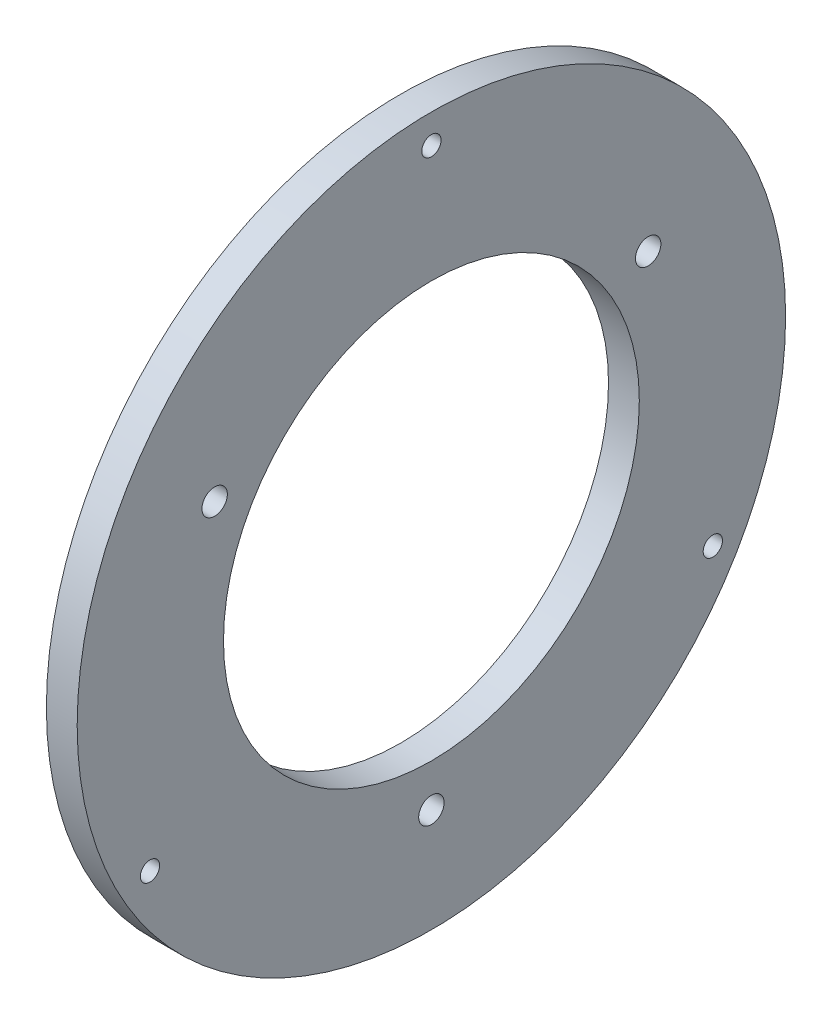
ISO-10303-21;
HEADER;
FILE_DESCRIPTION(('STEP AP214'),'2;1');
FILE_NAME('part.step','',(''),(''),'','','');
FILE_SCHEMA(('AUTOMOTIVE_DESIGN { 1 0 10303 214 1 1 1 1 }'));
ENDSEC;
DATA;
#1=APPLICATION_CONTEXT('core data for automotive mechanical design processes');
#2=APPLICATION_PROTOCOL_DEFINITION('international standard','automotive_design',2000,#1);
#3=PRODUCT_CONTEXT('',#1,'mechanical');
#4=PRODUCT('Part','Part','',(#3));
#5=PRODUCT_RELATED_PRODUCT_CATEGORY('part','',(#4));
#6=PRODUCT_DEFINITION_FORMATION('','',#4);
#7=PRODUCT_DEFINITION_CONTEXT('part definition',#1,'design');
#8=PRODUCT_DEFINITION('design','',#6,#7);
#9=PRODUCT_DEFINITION_SHAPE('','',#8);
#10=(LENGTH_UNIT() NAMED_UNIT(*) SI_UNIT(.MILLI.,.METRE.));
#11=(NAMED_UNIT(*) PLANE_ANGLE_UNIT() SI_UNIT($,.RADIAN.));
#12=(NAMED_UNIT(*) SI_UNIT($,.STERADIAN.) SOLID_ANGLE_UNIT());
#13=UNCERTAINTY_MEASURE_WITH_UNIT(LENGTH_MEASURE(1.E-05),#10,'distance_accuracy_value','');
#14=(GEOMETRIC_REPRESENTATION_CONTEXT(3) GLOBAL_UNCERTAINTY_ASSIGNED_CONTEXT((#13)) GLOBAL_UNIT_ASSIGNED_CONTEXT((#10,
#11,#12)) REPRESENTATION_CONTEXT('',''));
#15=CARTESIAN_POINT('',(0.,0.,0.));
#16=DIRECTION('',(0.,0.,1.));
#17=DIRECTION('',(1.,0.,0.));
#18=AXIS2_PLACEMENT_3D('',#15,#16,#17);
#19=CARTESIAN_POINT('',(131.7,46.,0.));
#20=DIRECTION('',(1.,0.,0.));
#21=DIRECTION('',(0.,0.,-1.));
#22=AXIS2_PLACEMENT_3D('',#19,#20,#21);
#23=PLANE('',#22);
#24=CARTESIAN_POINT('',(131.7,42.2,0.));
#25=DIRECTION('',(1.,0.,0.));
#26=DIRECTION('',(0.,0.,-1.));
#27=AXIS2_PLACEMENT_3D('',#24,#25,#26);
#28=CIRCLE('',#27,1.25);
#29=CARTESIAN_POINT('',(131.7,42.2,-1.25));
#30=VERTEX_POINT('',#29);
#31=EDGE_CURVE('E50',#30,#30,#28,.F.);
#32=ORIENTED_EDGE('',*,*,#31,.F.);
#33=EDGE_LOOP('',(#32));
#34=FACE_BOUND('',#33,.T.);
#35=CARTESIAN_POINT('',(131.7,16.25,-28.1458256229943));
#36=DIRECTION('',(1.,0.,0.));
#37=DIRECTION('',(0.,0.,-1.));
#38=AXIS2_PLACEMENT_3D('',#35,#36,#37);
#39=CIRCLE('',#38,1.65);
#40=CARTESIAN_POINT('',(131.7,16.25,-29.7958256229943));
#41=VERTEX_POINT('',#40);
#42=EDGE_CURVE('E53',#41,#41,#39,.F.);
#43=ORIENTED_EDGE('',*,*,#42,.F.);
#44=EDGE_LOOP('',(#43));
#45=FACE_BOUND('',#44,.T.);
#46=CARTESIAN_POINT('',(131.7,-21.1,36.5462720397033));
#47=DIRECTION('',(1.,0.,0.));
#48=DIRECTION('',(0.,0.,-1.));
#49=AXIS2_PLACEMENT_3D('',#46,#47,#48);
#50=CIRCLE('',#49,1.25);
#51=CARTESIAN_POINT('',(131.7,-21.1,35.2962720397033));
#52=VERTEX_POINT('',#51);
#53=EDGE_CURVE('E56',#52,#52,#50,.F.);
#54=ORIENTED_EDGE('',*,*,#53,.F.);
#55=EDGE_LOOP('',(#54));
#56=FACE_BOUND('',#55,.T.);
#57=CARTESIAN_POINT('',(131.7,-21.1,-36.5462720397033));
#58=DIRECTION('',(1.,0.,0.));
#59=DIRECTION('',(0.,0.,-1.));
#60=AXIS2_PLACEMENT_3D('',#57,#58,#59);
#61=CIRCLE('',#60,1.25);
#62=CARTESIAN_POINT('',(131.7,-21.1,-37.7962720397033));
#63=VERTEX_POINT('',#62);
#64=EDGE_CURVE('E59',#63,#63,#61,.F.);
#65=ORIENTED_EDGE('',*,*,#64,.F.);
#66=EDGE_LOOP('',(#65));
#67=FACE_BOUND('',#66,.T.);
#68=CARTESIAN_POINT('',(131.7,16.25,28.1458256229943));
#69=DIRECTION('',(1.,0.,0.));
#70=DIRECTION('',(0.,0.,-1.));
#71=AXIS2_PLACEMENT_3D('',#68,#69,#70);
#72=CIRCLE('',#71,1.65);
#73=CARTESIAN_POINT('',(131.7,16.25,26.4958256229943));
#74=VERTEX_POINT('',#73);
#75=EDGE_CURVE('E62',#74,#74,#72,.F.);
#76=ORIENTED_EDGE('',*,*,#75,.F.);
#77=EDGE_LOOP('',(#76));
#78=FACE_BOUND('',#77,.T.);
#79=CARTESIAN_POINT('',(131.7,-32.5,0.));
#80=DIRECTION('',(1.,0.,0.));
#81=DIRECTION('',(0.,0.,-1.));
#82=AXIS2_PLACEMENT_3D('',#79,#80,#81);
#83=CIRCLE('',#82,1.65);
#84=CARTESIAN_POINT('',(131.7,-32.5,-1.65));
#85=VERTEX_POINT('',#84);
#86=EDGE_CURVE('E65',#85,#85,#83,.F.);
#87=ORIENTED_EDGE('',*,*,#86,.F.);
#88=EDGE_LOOP('',(#87));
#89=FACE_BOUND('',#88,.T.);
#90=CARTESIAN_POINT('',(131.7,0.,0.));
#91=DIRECTION('',(-1.,0.,0.));
#92=DIRECTION('',(0.,0.,1.));
#93=AXIS2_PLACEMENT_3D('',#90,#91,#92);
#94=CIRCLE('',#93,27.);
#95=CARTESIAN_POINT('',(131.7,0.,27.));
#96=VERTEX_POINT('',#95);
#97=EDGE_CURVE('E10',#96,#96,#94,.T.);
#98=ORIENTED_EDGE('',*,*,#97,.F.);
#99=EDGE_LOOP('',(#98));
#100=FACE_BOUND('',#99,.T.);
#101=CARTESIAN_POINT('',(131.7,0.,0.));
#102=DIRECTION('',(-1.,0.,0.));
#103=DIRECTION('',(0.,0.,1.));
#104=AXIS2_PLACEMENT_3D('',#101,#102,#103);
#105=CIRCLE('',#104,46.);
#106=CARTESIAN_POINT('',(131.7,0.,46.));
#107=VERTEX_POINT('',#106);
#108=EDGE_CURVE('E45',#107,#107,#105,.T.);
#109=ORIENTED_EDGE('',*,*,#108,.T.);
#110=EDGE_LOOP('',(#109));
#111=FACE_BOUND('',#110,.T.);
#112=ADVANCED_FACE('F31',(#34,#45,#56,#67,#78,#89,#100,#111),#23,.F.);
#113=CARTESIAN_POINT('',(-110.,0.,0.));
#114=DIRECTION('',(-1.,0.,0.));
#115=DIRECTION('',(0.,0.,1.));
#116=AXIS2_PLACEMENT_3D('',#113,#114,#115);
#117=CYLINDRICAL_SURFACE('',#116,27.);
#118=CARTESIAN_POINT('',(135.7,0.,0.));
#119=DIRECTION('',(-1.,0.,0.));
#120=DIRECTION('',(0.,0.,1.));
#121=AXIS2_PLACEMENT_3D('',#118,#119,#120);
#122=CIRCLE('',#121,27.);
#123=CARTESIAN_POINT('',(135.7,0.,27.));
#124=VERTEX_POINT('',#123);
#125=EDGE_CURVE('E37',#124,#124,#122,.T.);
#126=ORIENTED_EDGE('',*,*,#125,.F.);
#127=EDGE_LOOP('',(#126));
#128=FACE_BOUND('',#127,.T.);
#129=ORIENTED_EDGE('',*,*,#97,.T.);
#130=EDGE_LOOP('',(#129));
#131=FACE_BOUND('',#130,.T.);
#132=ADVANCED_FACE('F94',(#128,#131),#117,.F.);
#133=CARTESIAN_POINT('',(135.7,27.,0.));
#134=DIRECTION('',(-1.,0.,0.));
#135=DIRECTION('',(0.,0.,1.));
#136=AXIS2_PLACEMENT_3D('',#133,#134,#135);
#137=PLANE('',#136);
#138=CARTESIAN_POINT('',(135.7,42.2,0.));
#139=DIRECTION('',(1.,0.,0.));
#140=DIRECTION('',(0.,0.,-1.));
#141=AXIS2_PLACEMENT_3D('',#138,#139,#140);
#142=CIRCLE('',#141,1.25);
#143=CARTESIAN_POINT('',(135.7,42.2,-1.25));
#144=VERTEX_POINT('',#143);
#145=EDGE_CURVE('E68',#144,#144,#142,.T.);
#146=ORIENTED_EDGE('',*,*,#145,.F.);
#147=EDGE_LOOP('',(#146));
#148=FACE_BOUND('',#147,.T.);
#149=CARTESIAN_POINT('',(135.7,16.25,-28.1458256229943));
#150=DIRECTION('',(1.,0.,0.));
#151=DIRECTION('',(0.,0.,-1.));
#152=AXIS2_PLACEMENT_3D('',#149,#150,#151);
#153=CIRCLE('',#152,1.65);
#154=CARTESIAN_POINT('',(135.7,16.25,-29.7958256229943));
#155=VERTEX_POINT('',#154);
#156=EDGE_CURVE('E79',#155,#155,#153,.T.);
#157=ORIENTED_EDGE('',*,*,#156,.F.);
#158=EDGE_LOOP('',(#157));
#159=FACE_BOUND('',#158,.T.);
#160=CARTESIAN_POINT('',(135.7,-21.1,36.5462720397033));
#161=DIRECTION('',(1.,0.,0.));
#162=DIRECTION('',(0.,0.,-1.));
#163=AXIS2_PLACEMENT_3D('',#160,#161,#162);
#164=CIRCLE('',#163,1.25);
#165=CARTESIAN_POINT('',(135.7,-21.1,35.2962720397033));
#166=VERTEX_POINT('',#165);
#167=EDGE_CURVE('E72',#166,#166,#164,.T.);
#168=ORIENTED_EDGE('',*,*,#167,.F.);
#169=EDGE_LOOP('',(#168));
#170=FACE_BOUND('',#169,.T.);
#171=CARTESIAN_POINT('',(135.7,-21.1,-36.5462720397033));
#172=DIRECTION('',(1.,0.,0.));
#173=DIRECTION('',(0.,0.,-1.));
#174=AXIS2_PLACEMENT_3D('',#171,#172,#173);
#175=CIRCLE('',#174,1.25);
#176=CARTESIAN_POINT('',(135.7,-21.1,-37.7962720397033));
#177=VERTEX_POINT('',#176);
#178=EDGE_CURVE('E69',#177,#177,#175,.T.);
#179=ORIENTED_EDGE('',*,*,#178,.F.);
#180=EDGE_LOOP('',(#179));
#181=FACE_BOUND('',#180,.T.);
#182=CARTESIAN_POINT('',(135.7,16.25,28.1458256229943));
#183=DIRECTION('',(1.,0.,0.));
#184=DIRECTION('',(0.,0.,-1.));
#185=AXIS2_PLACEMENT_3D('',#182,#183,#184);
#186=CIRCLE('',#185,1.65);
#187=CARTESIAN_POINT('',(135.7,16.25,26.4958256229943));
#188=VERTEX_POINT('',#187);
#189=EDGE_CURVE('E73',#188,#188,#186,.T.);
#190=ORIENTED_EDGE('',*,*,#189,.F.);
#191=EDGE_LOOP('',(#190));
#192=FACE_BOUND('',#191,.T.);
#193=CARTESIAN_POINT('',(135.7,-32.5,0.));
#194=DIRECTION('',(1.,0.,0.));
#195=DIRECTION('',(0.,0.,-1.));
#196=AXIS2_PLACEMENT_3D('',#193,#194,#195);
#197=CIRCLE('',#196,1.65);
#198=CARTESIAN_POINT('',(135.7,-32.5,-1.65));
#199=VERTEX_POINT('',#198);
#200=EDGE_CURVE('E76',#199,#199,#197,.T.);
#201=ORIENTED_EDGE('',*,*,#200,.F.);
#202=EDGE_LOOP('',(#201));
#203=FACE_BOUND('',#202,.T.);
#204=CARTESIAN_POINT('',(135.7,0.,0.));
#205=DIRECTION('',(-1.,0.,0.));
#206=DIRECTION('',(0.,0.,1.));
#207=AXIS2_PLACEMENT_3D('',#204,#205,#206);
#208=CIRCLE('',#207,46.);
#209=CARTESIAN_POINT('',(135.7,0.,46.));
#210=VERTEX_POINT('',#209);
#211=EDGE_CURVE('E41',#210,#210,#208,.T.);
#212=ORIENTED_EDGE('',*,*,#211,.F.);
#213=EDGE_LOOP('',(#212));
#214=FACE_BOUND('',#213,.T.);
#215=ORIENTED_EDGE('',*,*,#125,.T.);
#216=EDGE_LOOP('',(#215));
#217=FACE_BOUND('',#216,.T.);
#218=ADVANCED_FACE('F90',(#148,#159,#170,#181,#192,#203,#214,#217),#137,.F.);
#219=CARTESIAN_POINT('',(-110.,0.,0.));
#220=DIRECTION('',(-1.,0.,0.));
#221=DIRECTION('',(0.,0.,1.));
#222=AXIS2_PLACEMENT_3D('',#219,#220,#221);
#223=CYLINDRICAL_SURFACE('',#222,46.);
#224=ORIENTED_EDGE('',*,*,#108,.F.);
#225=EDGE_LOOP('',(#224));
#226=FACE_BOUND('',#225,.T.);
#227=ORIENTED_EDGE('',*,*,#211,.T.);
#228=EDGE_LOOP('',(#227));
#229=FACE_BOUND('',#228,.T.);
#230=ADVANCED_FACE('F93',(#226,#229),#223,.T.);
#231=CARTESIAN_POINT('',(135.7,-32.5,0.));
#232=DIRECTION('',(-1.,0.,0.));
#233=DIRECTION('',(0.,0.,1.));
#234=AXIS2_PLACEMENT_3D('',#231,#232,#233);
#235=CYLINDRICAL_SURFACE('',#234,1.65);
#236=ORIENTED_EDGE('',*,*,#200,.T.);
#237=EDGE_LOOP('',(#236));
#238=FACE_BOUND('',#237,.T.);
#239=ORIENTED_EDGE('',*,*,#86,.T.);
#240=EDGE_LOOP('',(#239));
#241=FACE_BOUND('',#240,.T.);
#242=ADVANCED_FACE('F109',(#238,#241),#235,.F.);
#243=CARTESIAN_POINT('',(135.7,16.25,28.1458256229943));
#244=DIRECTION('',(-1.,0.,0.));
#245=DIRECTION('',(0.,0.,1.));
#246=AXIS2_PLACEMENT_3D('',#243,#244,#245);
#247=CYLINDRICAL_SURFACE('',#246,1.65);
#248=ORIENTED_EDGE('',*,*,#189,.T.);
#249=EDGE_LOOP('',(#248));
#250=FACE_BOUND('',#249,.T.);
#251=ORIENTED_EDGE('',*,*,#75,.T.);
#252=EDGE_LOOP('',(#251));
#253=FACE_BOUND('',#252,.T.);
#254=ADVANCED_FACE('F115',(#250,#253),#247,.F.);
#255=CARTESIAN_POINT('',(135.7,-21.1,-36.5462720397033));
#256=DIRECTION('',(-1.,0.,0.));
#257=DIRECTION('',(0.,0.,1.));
#258=AXIS2_PLACEMENT_3D('',#255,#256,#257);
#259=CYLINDRICAL_SURFACE('',#258,1.25);
#260=ORIENTED_EDGE('',*,*,#178,.T.);
#261=EDGE_LOOP('',(#260));
#262=FACE_BOUND('',#261,.T.);
#263=ORIENTED_EDGE('',*,*,#64,.T.);
#264=EDGE_LOOP('',(#263));
#265=FACE_BOUND('',#264,.T.);
#266=ADVANCED_FACE('F142',(#262,#265),#259,.F.);
#267=CARTESIAN_POINT('',(135.7,-21.1,36.5462720397033));
#268=DIRECTION('',(-1.,0.,0.));
#269=DIRECTION('',(0.,0.,1.));
#270=AXIS2_PLACEMENT_3D('',#267,#268,#269);
#271=CYLINDRICAL_SURFACE('',#270,1.25);
#272=ORIENTED_EDGE('',*,*,#167,.T.);
#273=EDGE_LOOP('',(#272));
#274=FACE_BOUND('',#273,.T.);
#275=ORIENTED_EDGE('',*,*,#53,.T.);
#276=EDGE_LOOP('',(#275));
#277=FACE_BOUND('',#276,.T.);
#278=ADVANCED_FACE('F148',(#274,#277),#271,.F.);
#279=CARTESIAN_POINT('',(135.7,16.25,-28.1458256229943));
#280=DIRECTION('',(-1.,0.,0.));
#281=DIRECTION('',(0.,0.,1.));
#282=AXIS2_PLACEMENT_3D('',#279,#280,#281);
#283=CYLINDRICAL_SURFACE('',#282,1.65);
#284=ORIENTED_EDGE('',*,*,#156,.T.);
#285=EDGE_LOOP('',(#284));
#286=FACE_BOUND('',#285,.T.);
#287=ORIENTED_EDGE('',*,*,#42,.T.);
#288=EDGE_LOOP('',(#287));
#289=FACE_BOUND('',#288,.T.);
#290=ADVANCED_FACE('F151',(#286,#289),#283,.F.);
#291=CARTESIAN_POINT('',(135.7,42.2,0.));
#292=DIRECTION('',(-1.,0.,0.));
#293=DIRECTION('',(0.,0.,1.));
#294=AXIS2_PLACEMENT_3D('',#291,#292,#293);
#295=CYLINDRICAL_SURFACE('',#294,1.25);
#296=ORIENTED_EDGE('',*,*,#145,.T.);
#297=EDGE_LOOP('',(#296));
#298=FACE_BOUND('',#297,.T.);
#299=ORIENTED_EDGE('',*,*,#31,.T.);
#300=EDGE_LOOP('',(#299));
#301=FACE_BOUND('',#300,.T.);
#302=ADVANCED_FACE('F87',(#298,#301),#295,.F.);
#303=CLOSED_SHELL('',(#112,#132,#218,#230,#242,#254,#266,#278,#290,#302));
#304=MANIFOLD_SOLID_BREP('B2',#303);
#305=ADVANCED_BREP_SHAPE_REPRESENTATION('',(#18,#304),#14);
#306=SHAPE_DEFINITION_REPRESENTATION(#9,#305);
ENDSEC;
END-ISO-10303-21;
